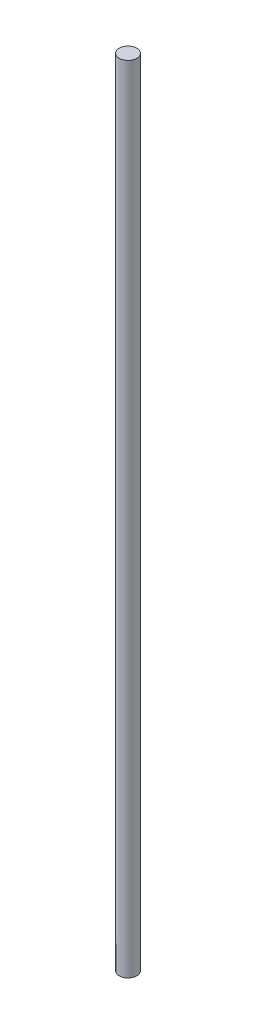
ISO-10303-21;
HEADER;
FILE_DESCRIPTION(('STEP AP214'),'2;1');
FILE_NAME('part.step','',(''),(''),'','','');
FILE_SCHEMA(('AUTOMOTIVE_DESIGN { 1 0 10303 214 1 1 1 1 }'));
ENDSEC;
DATA;
#1=APPLICATION_CONTEXT('core data for automotive mechanical design processes');
#2=APPLICATION_PROTOCOL_DEFINITION('international standard','automotive_design',2000,#1);
#3=PRODUCT_CONTEXT('',#1,'mechanical');
#4=PRODUCT('Part','Part','',(#3));
#5=PRODUCT_RELATED_PRODUCT_CATEGORY('part','',(#4));
#6=PRODUCT_DEFINITION_FORMATION('','',#4);
#7=PRODUCT_DEFINITION_CONTEXT('part definition',#1,'design');
#8=PRODUCT_DEFINITION('design','',#6,#7);
#9=PRODUCT_DEFINITION_SHAPE('','',#8);
#10=(LENGTH_UNIT() NAMED_UNIT(*) SI_UNIT(.MILLI.,.METRE.));
#11=(NAMED_UNIT(*) PLANE_ANGLE_UNIT() SI_UNIT($,.RADIAN.));
#12=(NAMED_UNIT(*) SI_UNIT($,.STERADIAN.) SOLID_ANGLE_UNIT());
#13=UNCERTAINTY_MEASURE_WITH_UNIT(LENGTH_MEASURE(1.E-05),#10,'distance_accuracy_value','');
#14=(GEOMETRIC_REPRESENTATION_CONTEXT(3) GLOBAL_UNCERTAINTY_ASSIGNED_CONTEXT((#13)) GLOBAL_UNIT_ASSIGNED_CONTEXT((#10,
#11,#12)) REPRESENTATION_CONTEXT('',''));
#15=CARTESIAN_POINT('',(0.,0.,0.));
#16=DIRECTION('',(0.,0.,1.));
#17=DIRECTION('',(1.,0.,0.));
#18=AXIS2_PLACEMENT_3D('',#15,#16,#17);
#19=CARTESIAN_POINT('',(-499.653693809529,64.9986246749015,-607.746407760674));
#20=DIRECTION('',(0.,-1.,0.));
#21=DIRECTION('',(1.,0.,0.));
#22=AXIS2_PLACEMENT_3D('',#19,#20,#21);
#23=CYLINDRICAL_SURFACE('',#22,1.49999999999997);
#24=CARTESIAN_POINT('',(-499.653693809529,64.9986246749015,-607.746407760674));
#25=DIRECTION('',(0.,1.,0.));
#26=DIRECTION('',(-1.,0.,0.));
#27=AXIS2_PLACEMENT_3D('',#24,#25,#26);
#28=CIRCLE('',#27,1.49999999999997);
#29=CARTESIAN_POINT('',(-501.153693809529,64.9986246749015,-607.746407760674));
#30=VERTEX_POINT('',#29);
#31=EDGE_CURVE('E10',#30,#30,#28,.T.);
#32=ORIENTED_EDGE('',*,*,#31,.F.);
#33=EDGE_LOOP('',(#32));
#34=FACE_BOUND('',#33,.T.);
#35=CARTESIAN_POINT('',(-499.653693809529,-70.0013753250986,-607.746407760674));
#36=DIRECTION('',(0.,1.,0.));
#37=DIRECTION('',(-1.,0.,0.));
#38=AXIS2_PLACEMENT_3D('',#35,#36,#37);
#39=CIRCLE('',#38,1.49999999999997);
#40=CARTESIAN_POINT('',(-501.153693809529,-70.0013753250986,-607.746407760674));
#41=VERTEX_POINT('',#40);
#42=EDGE_CURVE('E34',#41,#41,#39,.T.);
#43=ORIENTED_EDGE('',*,*,#42,.T.);
#44=EDGE_LOOP('',(#43));
#45=FACE_BOUND('',#44,.T.);
#46=ADVANCED_FACE('F31',(#34,#45),#23,.T.);
#47=CARTESIAN_POINT('',(-499.653693809529,64.9986246749015,-607.746407760674));
#48=DIRECTION('',(0.,1.,0.));
#49=DIRECTION('',(-1.,0.,0.));
#50=AXIS2_PLACEMENT_3D('',#47,#48,#49);
#51=PLANE('',#50);
#52=ORIENTED_EDGE('',*,*,#31,.T.);
#53=EDGE_LOOP('',(#52));
#54=FACE_BOUND('',#53,.T.);
#55=ADVANCED_FACE('F46',(#54),#51,.T.);
#56=CARTESIAN_POINT('',(-499.653693809529,-70.0013753250986,-607.746407760674));
#57=DIRECTION('',(0.,1.,0.));
#58=DIRECTION('',(-1.,0.,0.));
#59=AXIS2_PLACEMENT_3D('',#56,#57,#58);
#60=PLANE('',#59);
#61=ORIENTED_EDGE('',*,*,#42,.F.);
#62=EDGE_LOOP('',(#61));
#63=FACE_BOUND('',#62,.T.);
#64=ADVANCED_FACE('F44',(#63),#60,.F.);
#65=CLOSED_SHELL('',(#46,#55,#64));
#66=MANIFOLD_SOLID_BREP('B2',#65);
#67=ADVANCED_BREP_SHAPE_REPRESENTATION('',(#18,#66),#14);
#68=SHAPE_DEFINITION_REPRESENTATION(#9,#67);
ENDSEC;
END-ISO-10303-21;
